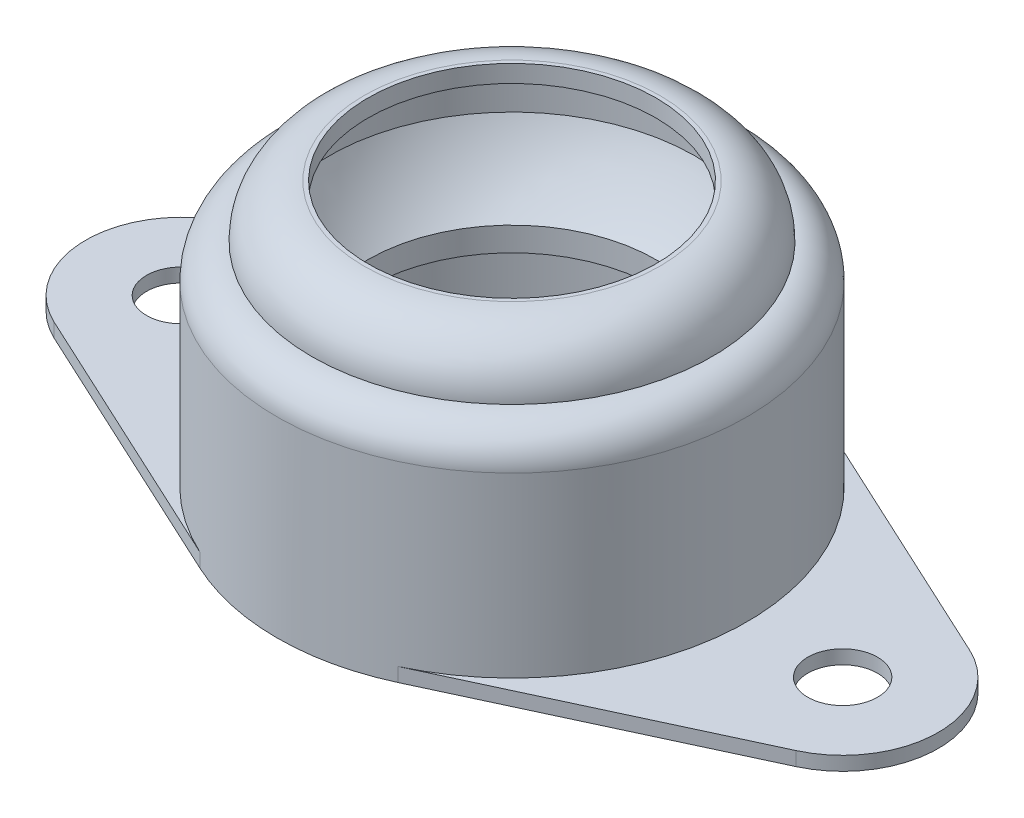
ISO-10303-21;
HEADER;
FILE_DESCRIPTION(('STEP AP214'),'2;1');
FILE_NAME('part.step','',(''),(''),'','','');
FILE_SCHEMA(('AUTOMOTIVE_DESIGN { 1 0 10303 214 1 1 1 1 }'));
ENDSEC;
DATA;
#1=APPLICATION_CONTEXT('core data for automotive mechanical design processes');
#2=APPLICATION_PROTOCOL_DEFINITION('international standard','automotive_design',2000,#1);
#3=PRODUCT_CONTEXT('',#1,'mechanical');
#4=PRODUCT('Part','Part','',(#3));
#5=PRODUCT_RELATED_PRODUCT_CATEGORY('part','',(#4));
#6=PRODUCT_DEFINITION_FORMATION('','',#4);
#7=PRODUCT_DEFINITION_CONTEXT('part definition',#1,'design');
#8=PRODUCT_DEFINITION('design','',#6,#7);
#9=PRODUCT_DEFINITION_SHAPE('','',#8);
#10=(LENGTH_UNIT() NAMED_UNIT(*) SI_UNIT(.MILLI.,.METRE.));
#11=(NAMED_UNIT(*) PLANE_ANGLE_UNIT() SI_UNIT($,.RADIAN.));
#12=(NAMED_UNIT(*) SI_UNIT($,.STERADIAN.) SOLID_ANGLE_UNIT());
#13=UNCERTAINTY_MEASURE_WITH_UNIT(LENGTH_MEASURE(1.E-05),#10,'distance_accuracy_value','');
#14=(GEOMETRIC_REPRESENTATION_CONTEXT(3) GLOBAL_UNCERTAINTY_ASSIGNED_CONTEXT((#13)) GLOBAL_UNIT_ASSIGNED_CONTEXT((#10,
#11,#12)) REPRESENTATION_CONTEXT('',''));
#15=CARTESIAN_POINT('',(0.,0.,0.));
#16=DIRECTION('',(0.,0.,1.));
#17=DIRECTION('',(1.,0.,0.));
#18=AXIS2_PLACEMENT_3D('',#15,#16,#17);
#19=CARTESIAN_POINT('',(0.,16.,0.));
#20=DIRECTION('',(0.,-1.,0.));
#21=DIRECTION('',(-1.,0.,0.));
#22=AXIS2_PLACEMENT_3D('',#19,#20,#21);
#23=SPHERICAL_SURFACE('',#22,12.5399362039845);
#24=CARTESIAN_POINT('',(0.,10.7108906022991,0.));
#25=DIRECTION('',(0.,-1.,0.));
#26=DIRECTION('',(0.,0.,-1.));
#27=AXIS2_PLACEMENT_3D('',#24,#25,#26);
#28=CIRCLE('',#27,11.3699305969365);
#29=CARTESIAN_POINT('',(-11.3699305969365,10.7108906022991,0.));
#30=VERTEX_POINT('',#29);
#31=EDGE_CURVE('E213',#30,#30,#28,.T.);
#32=CARTESIAN_POINT('',(0.,6.57281984399367,0.));
#33=DIRECTION('',(0.,1.,0.));
#34=DIRECTION('',(0.,0.,1.));
#35=AXIS2_PLACEMENT_3D('',#32,#33,#34);
#36=CIRCLE('',#35,8.26911569070118);
#37=CARTESIAN_POINT('',(-8.26911569070118,6.57281984399367,0.));
#38=VERTEX_POINT('',#37);
#39=EDGE_CURVE('E403',#38,#38,#36,.T.);
#40=CARTESIAN_POINT('',(-11.3699305969365,10.7108906022991,0.));
#41=CARTESIAN_POINT('',(-11.3470476628489,10.6616994020522,0.));
#42=CARTESIAN_POINT('',(-11.3238454577825,10.6126567220733,0.));
#43=CARTESIAN_POINT('',(-11.2768064986296,10.5148766237988,0.));
#44=CARTESIAN_POINT('',(-11.2529697445431,10.4661392055032,0.));
#45=CARTESIAN_POINT('',(-11.2046656802875,10.368977851743,0.));
#46=CARTESIAN_POINT('',(-11.1801983701183,10.3205539162783,0.));
#47=CARTESIAN_POINT('',(-11.1306373215008,10.2240276827389,0.));
#48=CARTESIAN_POINT('',(-11.1055435830523,10.1759253846643,0.));
#49=CARTESIAN_POINT('',(-11.0547339035324,10.0800505299735,0.));
#50=CARTESIAN_POINT('',(-11.0290179624609,10.0322779733573,0.));
#51=CARTESIAN_POINT('',(-10.9769682102236,9.93707064911464,0.));
#52=CARTESIAN_POINT('',(-10.9506343990578,9.88963588148808,0.));
#53=CARTESIAN_POINT('',(-10.8973533426957,9.79511212611695,0.));
#54=CARTESIAN_POINT('',(-10.8704060974993,9.74802313837237,0.));
#55=CARTESIAN_POINT('',(-10.8159027126261,9.65419887533668,0.));
#56=CARTESIAN_POINT('',(-10.7883465729493,9.60746360004556,0.));
#57=CARTESIAN_POINT('',(-10.7326300412,9.51435463492106,0.));
#58=CARTESIAN_POINT('',(-10.7044696491274,9.46798094508768,0.));
#59=CARTESIAN_POINT('',(-10.6475493564739,9.37560296296536,0.));
#60=CARTESIAN_POINT('',(-10.6187894558929,9.32959867067641,0.));
#61=CARTESIAN_POINT('',(-10.5606749910997,9.23796723350249,0.));
#62=CARTESIAN_POINT('',(-10.5313204268876,9.19234008861751,0.));
#63=CARTESIAN_POINT('',(-10.4720215798871,9.10147063257663,0.));
#64=CARTESIAN_POINT('',(-10.4420772970987,9.05622832142073,0.));
#65=CARTESIAN_POINT('',(-10.381604057344,8.96613615433434,0.));
#66=CARTESIAN_POINT('',(-10.3510751003777,8.92128629840384,0.));
#67=CARTESIAN_POINT('',(-10.2894376551594,8.83198659715174,0.));
#68=CARTESIAN_POINT('',(-10.2583291669074,8.78753675183014,0.));
#69=CARTESIAN_POINT('',(-10.1955378996376,8.69904455979375,0.));
#70=CARTESIAN_POINT('',(-10.1638551206198,8.65500221307896,0.));
#71=CARTESIAN_POINT('',(-10.0999206090829,8.5673324376071,0.));
#72=CARTESIAN_POINT('',(-10.0676688765637,8.52370500885003,0.));
#73=CARTESIAN_POINT('',(-10.0026018911343,8.43687241874767,0.));
#74=CARTESIAN_POINT('',(-9.96978663822408,8.39366725740237,0.));
#75=CARTESIAN_POINT('',(-9.90359814005291,8.30768648044265,0.));
#76=CARTESIAN_POINT('',(-9.870224894792,8.26491086482822,0.));
#77=CARTESIAN_POINT('',(-9.80292603395915,8.17979638528829,0.));
#78=CARTESIAN_POINT('',(-9.76900041838721,8.13745752136278,0.));
#79=CARTESIAN_POINT('',(-9.70060253202392,8.05322367758376,0.));
#80=CARTESIAN_POINT('',(-9.66613026123257,8.01132869773025,0.));
#81=CARTESIAN_POINT('',(-9.59664487161134,7.92798967970185,0.));
#82=CARTESIAN_POINT('',(-9.56163175278146,7.88654564152695,0.));
#83=CARTESIAN_POINT('',(-9.49107056537505,7.80411548849694,0.));
#84=CARTESIAN_POINT('',(-9.45552249679852,7.76312937364182,0.));
#85=CARTESIAN_POINT('',(-9.38389739830793,7.68162197175117,0.));
#86=CARTESIAN_POINT('',(-9.34782036839386,7.64110068471564,0.));
#87=CARTESIAN_POINT('',(-9.27514342474639,7.5605297646587,0.));
#88=CARTESIAN_POINT('',(-9.23854351101299,7.52048013163729,0.));
#89=CARTESIAN_POINT('',(-9.16482696532771,7.44085926635085,0.));
#90=CARTESIAN_POINT('',(-9.12771033337583,7.40128803408583,0.));
#91=CARTESIAN_POINT('',(-9.05296660390838,7.32263063645458,0.));
#92=CARTESIAN_POINT('',(-9.01533950639281,7.28354447108835,0.));
#93=CARTESIAN_POINT('',(-8.93958118441617,7.20586379171557,0.));
#94=CARTESIAN_POINT('',(-8.90144995995511,7.16726927770903,0.));
#95=CARTESIAN_POINT('',(-8.82468980774026,7.09057840257144,0.));
#96=CARTESIAN_POINT('',(-8.78606087998648,7.0524820414404,0.));
#97=CARTESIAN_POINT('',(-8.70831182827267,6.97679389010545,0.));
#98=CARTESIAN_POINT('',(-8.66919170431265,6.93920209990154,0.));
#99=CARTESIAN_POINT('',(-8.59046685154645,6.86452942177687,0.));
#100=CARTESIAN_POINT('',(-8.55086212274029,6.82744853385611,0.));
#101=CARTESIAN_POINT('',(-8.47117472757947,6.75380391191654,0.));
#102=CARTESIAN_POINT('',(-8.43109206122482,6.71724017789773,0.));
#103=CARTESIAN_POINT('',(-8.3504555600457,6.64463600464066,0.));
#104=CARTESIAN_POINT('',(-8.30990172522123,6.60859556540239,0.));
#105=CARTESIAN_POINT('',(-8.26911569070118,6.57281984399367,0.));
#106=B_SPLINE_CURVE_WITH_KNOTS('',3,(#40,#41,#42,#43,#44,#45,#46,#47,#48,#49,#50,#51,#52,#53,
#54,#55,#56,#57,#58,#59,#60,#61,#62,#63,#64,#65,#66,#67,#68,#69,#70,#71,#72,#73,#74,#75,#76,#77,
#78,#79,#80,#81,#82,#83,#84,#85,#86,#87,#88,#89,#90,#91,#92,#93,#94,#95,#96,#97,#98,#99,#100,
#101,#102,#103,#104,#105),.UNSPECIFIED.,.F.,.F.,(4,2,2,2,2,2,2,2,2,2,2,2,2,2,2,2,2,2,2,2,2,2,2,
2,2,2,2,2,2,2,2,2,4),(0.,0.162758267193495,0.325516534386989,0.488274801580485,0.65103306877398,
0.813791335967474,0.976549603160969,1.13930787035446,1.30206613754796,1.46482440474145,
1.62758267193495,1.79034093912844,1.95309920632194,2.11585747351543,2.27861574070893,
2.44137400790242,2.60413227509592,2.76689054228941,2.92964880948291,3.0924070766764,
3.2551653438699,3.41792361106339,3.58068187825689,3.74344014545038,3.90619841264388,
4.06895667983737,4.23171494703087,4.39447321422436,4.55723148141786,4.71998974861135,
4.88274801580485,5.04550628299834,5.20826455019184),.UNSPECIFIED.);
#107=EDGE_CURVE('BSEAM41',#30,#38,#106,.T.);
#108=ORIENTED_EDGE('',*,*,#31,.T.);
#109=ORIENTED_EDGE('',*,*,#39,.T.);
#110=ORIENTED_EDGE('',*,*,#107,.T.);
#111=ORIENTED_EDGE('',*,*,#107,.F.);
#112=EDGE_LOOP('',(#108,#110,#109,#111));
#113=FACE_BOUND('',#112,.T.);
#114=ADVANCED_FACE('F41',(#113),#23,.T.);
#115=CARTESIAN_POINT('',(0.,0.,0.));
#116=DIRECTION('',(0.,1.,0.));
#117=DIRECTION('',(0.,0.,1.));
#118=AXIS2_PLACEMENT_3D('',#115,#116,#117);
#119=PLANE('',#118);
#120=CARTESIAN_POINT('',(19.,0.,0.));
#121=DIRECTION('',(0.,-1.,0.));
#122=DIRECTION('',(0.,0.,-1.));
#123=AXIS2_PLACEMENT_3D('',#120,#121,#122);
#124=CIRCLE('',#123,2.);
#125=CARTESIAN_POINT('',(19.,0.,-2.));
#126=VERTEX_POINT('',#125);
#127=EDGE_CURVE('E138',#126,#126,#124,.T.);
#128=ORIENTED_EDGE('',*,*,#127,.F.);
#129=EDGE_LOOP('',(#128));
#130=FACE_BOUND('',#129,.T.);
#131=DIRECTION('',(0.90703620734811,0.,-0.421052631578947));
#132=VECTOR('',#131,1.);
#133=CARTESIAN_POINT('',(5.68421052631578,0.,12.2449887991995));
#134=LINE('',#133,#132);
#135=CARTESIAN_POINT('',(5.68421052631578,0.,12.2449887991995));
#136=VERTEX_POINT('',#135);
#137=CARTESIAN_POINT('',(21.3157894736842,0.,4.9886991404146));
#138=VERTEX_POINT('',#137);
#139=EDGE_CURVE('E132',#136,#138,#134,.T.);
#140=ORIENTED_EDGE('',*,*,#139,.F.);
#141=CARTESIAN_POINT('',(0.,0.,0.));
#142=DIRECTION('',(0.,1.,0.));
#143=DIRECTION('',(0.,0.,1.));
#144=AXIS2_PLACEMENT_3D('',#141,#142,#143);
#145=CIRCLE('',#144,13.5);
#146=CARTESIAN_POINT('',(5.68421052631579,0.,-12.2449887991995));
#147=VERTEX_POINT('',#146);
#148=EDGE_CURVE('E51',#136,#147,#145,.T.);
#149=ORIENTED_EDGE('',*,*,#148,.T.);
#150=DIRECTION('',(0.90703620734811,0.,0.421052631578947));
#151=VECTOR('',#150,1.);
#152=CARTESIAN_POINT('',(5.68421052631578,0.,-12.2449887991995));
#153=LINE('',#152,#151);
#154=CARTESIAN_POINT('',(21.3157894736842,0.,-4.9886991404146));
#155=VERTEX_POINT('',#154);
#156=EDGE_CURVE('E141',#147,#155,#153,.T.);
#157=ORIENTED_EDGE('',*,*,#156,.T.);
#158=CARTESIAN_POINT('',(19.,0.,0.));
#159=DIRECTION('',(0.,-1.,0.));
#160=DIRECTION('',(0.,0.,-1.));
#161=AXIS2_PLACEMENT_3D('',#158,#159,#160);
#162=CIRCLE('',#161,5.5);
#163=EDGE_CURVE('E113',#155,#138,#162,.T.);
#164=ORIENTED_EDGE('',*,*,#163,.T.);
#165=EDGE_LOOP('',(#140,#149,#157,#164));
#166=FACE_BOUND('',#165,.T.);
#167=ADVANCED_FACE('F221',(#130,#166),#119,.F.);
#168=CARTESIAN_POINT('',(0.,30.5884475921695,0.));
#169=DIRECTION('',(0.,1.,0.));
#170=DIRECTION('',(0.,0.,1.));
#171=AXIS2_PLACEMENT_3D('',#168,#169,#170);
#172=CYLINDRICAL_SURFACE('',#171,12.5);
#173=CARTESIAN_POINT('',(0.,1.,0.));
#174=DIRECTION('',(0.,1.,0.));
#175=DIRECTION('',(0.,0.,1.));
#176=AXIS2_PLACEMENT_3D('',#173,#174,#175);
#177=CIRCLE('',#176,12.5);
#178=CARTESIAN_POINT('',(0.,1.,12.5));
#179=VERTEX_POINT('',#178);
#180=EDGE_CURVE('E11',#179,#179,#177,.F.);
#181=ORIENTED_EDGE('',*,*,#180,.T.);
#182=EDGE_LOOP('',(#181));
#183=FACE_BOUND('',#182,.T.);
#184=CARTESIAN_POINT('',(0.,10.5,0.));
#185=DIRECTION('',(0.,1.,0.));
#186=DIRECTION('',(0.,0.,1.));
#187=AXIS2_PLACEMENT_3D('',#184,#185,#186);
#188=CIRCLE('',#187,12.5);
#189=CARTESIAN_POINT('',(0.,10.5,12.5));
#190=VERTEX_POINT('',#189);
#191=EDGE_CURVE('E206',#190,#190,#188,.F.);
#192=ORIENTED_EDGE('',*,*,#191,.F.);
#193=EDGE_LOOP('',(#192));
#194=FACE_BOUND('',#193,.T.);
#195=ADVANCED_FACE('F267',(#183,#194),#172,.F.);
#196=CARTESIAN_POINT('',(0.,30.5884475921695,0.));
#197=DIRECTION('',(0.,1.,0.));
#198=DIRECTION('',(0.,0.,1.));
#199=AXIS2_PLACEMENT_3D('',#196,#197,#198);
#200=CYLINDRICAL_SURFACE('',#199,13.5);
#201=CARTESIAN_POINT('',(0.,11.,0.));
#202=DIRECTION('',(0.,-1.,0.));
#203=DIRECTION('',(0.,0.,-1.));
#204=AXIS2_PLACEMENT_3D('',#201,#202,#203);
#205=CIRCLE('',#204,13.5);
#206=CARTESIAN_POINT('',(0.,11.,-13.5));
#207=VERTEX_POINT('',#206);
#208=EDGE_CURVE('E200',#207,#207,#205,.T.);
#209=ORIENTED_EDGE('',*,*,#208,.T.);
#210=EDGE_LOOP('',(#209));
#211=FACE_BOUND('',#210,.T.);
#212=DIRECTION('',(0.,-1.,0.));
#213=VECTOR('',#212,1.);
#214=CARTESIAN_POINT('',(5.68421052631579,0.8,-12.2449887991995));
#215=LINE('',#214,#213);
#216=CARTESIAN_POINT('',(5.68421052631579,0.799999999999999,-12.2449887991995));
#217=VERTEX_POINT('',#216);
#218=EDGE_CURVE('E128',#217,#147,#215,.T.);
#219=ORIENTED_EDGE('',*,*,#218,.T.);
#220=CARTESIAN_POINT('',(0.,0.,0.));
#221=DIRECTION('',(0.,1.,0.));
#222=DIRECTION('',(0.,0.,1.));
#223=AXIS2_PLACEMENT_3D('',#220,#221,#222);
#224=CIRCLE('',#223,13.5);
#225=CARTESIAN_POINT('',(-5.68421052631579,0.,-12.2449887991995));
#226=VERTEX_POINT('',#225);
#227=EDGE_CURVE('E188',#147,#226,#224,.T.);
#228=ORIENTED_EDGE('',*,*,#227,.T.);
#229=DIRECTION('',(0.,-1.,0.));
#230=VECTOR('',#229,1.);
#231=CARTESIAN_POINT('',(-5.68421052631579,0.8,-12.2449887991995));
#232=LINE('',#231,#230);
#233=CARTESIAN_POINT('',(-5.68421052631579,0.799999999999999,-12.2449887991995));
#234=VERTEX_POINT('',#233);
#235=EDGE_CURVE('E181',#234,#226,#232,.T.);
#236=ORIENTED_EDGE('',*,*,#235,.F.);
#237=CARTESIAN_POINT('',(0.,0.8,0.));
#238=DIRECTION('',(0.,-1.,0.));
#239=DIRECTION('',(0.,0.,-1.));
#240=AXIS2_PLACEMENT_3D('',#237,#238,#239);
#241=CIRCLE('',#240,13.5);
#242=CARTESIAN_POINT('',(-5.68421052631579,0.799999999999999,12.2449887991995));
#243=VERTEX_POINT('',#242);
#244=EDGE_CURVE('E156',#243,#234,#241,.T.);
#245=ORIENTED_EDGE('',*,*,#244,.F.);
#246=DIRECTION('',(0.,-1.,0.));
#247=VECTOR('',#246,1.);
#248=CARTESIAN_POINT('',(-5.68421052631579,0.8,12.2449887991995));
#249=LINE('',#248,#247);
#250=CARTESIAN_POINT('',(-5.68421052631579,0.,12.2449887991995));
#251=VERTEX_POINT('',#250);
#252=EDGE_CURVE('E178',#243,#251,#249,.T.);
#253=ORIENTED_EDGE('',*,*,#252,.T.);
#254=EDGE_CURVE('E189',#251,#136,#224,.T.);
#255=ORIENTED_EDGE('',*,*,#254,.T.);
#256=DIRECTION('',(0.,-1.,0.));
#257=VECTOR('',#256,1.);
#258=CARTESIAN_POINT('',(5.68421052631579,0.8,12.2449887991995));
#259=LINE('',#258,#257);
#260=CARTESIAN_POINT('',(5.68421052631579,0.799999999999999,12.2449887991995));
#261=VERTEX_POINT('',#260);
#262=EDGE_CURVE('E58',#261,#136,#259,.T.);
#263=ORIENTED_EDGE('',*,*,#262,.F.);
#264=CARTESIAN_POINT('',(0.,0.8,0.));
#265=DIRECTION('',(0.,-1.,0.));
#266=DIRECTION('',(0.,0.,-1.));
#267=AXIS2_PLACEMENT_3D('',#264,#265,#266);
#268=CIRCLE('',#267,13.5);
#269=EDGE_CURVE('E63',#217,#261,#268,.T.);
#270=ORIENTED_EDGE('',*,*,#269,.F.);
#271=EDGE_LOOP('',(#219,#228,#236,#245,#253,#255,#263,#270));
#272=FACE_BOUND('',#271,.T.);
#273=ADVANCED_FACE('F224',(#211,#272),#200,.T.);
#274=DIRECTION('',(-0.90703620734811,0.,0.421052631578947));
#275=VECTOR('',#274,1.);
#276=CARTESIAN_POINT('',(-5.68421052631578,0.,-12.2449887991995));
#277=LINE('',#276,#275);
#278=CARTESIAN_POINT('',(-21.3157894736842,0.,-4.9886991404146));
#279=VERTEX_POINT('',#278);
#280=EDGE_CURVE('E168',#226,#279,#277,.T.);
#281=ORIENTED_EDGE('',*,*,#280,.F.);
#282=CARTESIAN_POINT('',(0.,0.,0.));
#283=DIRECTION('',(0.,1.,0.));
#284=DIRECTION('',(0.,0.,1.));
#285=AXIS2_PLACEMENT_3D('',#282,#283,#284);
#286=CIRCLE('',#285,13.5);
#287=EDGE_CURVE('E209',#226,#251,#286,.T.);
#288=ORIENTED_EDGE('',*,*,#287,.T.);
#289=DIRECTION('',(-0.90703620734811,0.,-0.421052631578947));
#290=VECTOR('',#289,1.);
#291=CARTESIAN_POINT('',(-5.68421052631578,0.,12.2449887991995));
#292=LINE('',#291,#290);
#293=CARTESIAN_POINT('',(-21.3157894736842,0.,4.9886991404146));
#294=VERTEX_POINT('',#293);
#295=EDGE_CURVE('E170',#251,#294,#292,.T.);
#296=ORIENTED_EDGE('',*,*,#295,.T.);
#297=CARTESIAN_POINT('',(-19.,0.,0.));
#298=DIRECTION('',(0.,-1.,0.));
#299=DIRECTION('',(0.,0.,-1.));
#300=AXIS2_PLACEMENT_3D('',#297,#298,#299);
#301=CIRCLE('',#300,5.5);
#302=EDGE_CURVE('E148',#279,#294,#301,.F.);
#303=ORIENTED_EDGE('',*,*,#302,.F.);
#304=EDGE_LOOP('',(#281,#288,#296,#303));
#305=FACE_BOUND('',#304,.T.);
#306=CARTESIAN_POINT('',(-19.,0.,0.));
#307=DIRECTION('',(0.,-1.,0.));
#308=DIRECTION('',(0.,0.,-1.));
#309=AXIS2_PLACEMENT_3D('',#306,#307,#308);
#310=CIRCLE('',#309,2.);
#311=CARTESIAN_POINT('',(-19.,0.,-2.));
#312=VERTEX_POINT('',#311);
#313=EDGE_CURVE('E154',#312,#312,#310,.F.);
#314=ORIENTED_EDGE('',*,*,#313,.T.);
#315=EDGE_LOOP('',(#314));
#316=FACE_BOUND('',#315,.T.);
#317=ADVANCED_FACE('F233',(#305,#316),#119,.F.);
#318=CARTESIAN_POINT('',(0.,16.,0.));
#319=DIRECTION('',(0.,-1.,0.));
#320=DIRECTION('',(0.,0.,-1.));
#321=AXIS2_PLACEMENT_3D('',#318,#319,#320);
#322=PLANE('',#321);
#323=CARTESIAN_POINT('',(0.,16.,0.));
#324=DIRECTION('',(0.,-1.,0.));
#325=DIRECTION('',(0.,0.,-1.));
#326=AXIS2_PLACEMENT_3D('',#323,#324,#325);
#327=CIRCLE('',#326,8.26911569070118);
#328=CARTESIAN_POINT('',(0.,16.,-8.26911569070118));
#329=VERTEX_POINT('',#328);
#330=EDGE_CURVE('E361',#329,#329,#327,.F.);
#331=ORIENTED_EDGE('',*,*,#330,.F.);
#332=EDGE_LOOP('',(#331));
#333=FACE_BOUND('',#332,.T.);
#334=CARTESIAN_POINT('',(0.,16.,0.));
#335=DIRECTION('',(0.,-1.,0.));
#336=DIRECTION('',(0.,0.,-1.));
#337=AXIS2_PLACEMENT_3D('',#334,#335,#336);
#338=CIRCLE('',#337,8.5);
#339=CARTESIAN_POINT('',(0.,16.,-8.5));
#340=VERTEX_POINT('',#339);
#341=EDGE_CURVE('E203',#340,#340,#338,.F.);
#342=ORIENTED_EDGE('',*,*,#341,.T.);
#343=EDGE_LOOP('',(#342));
#344=FACE_BOUND('',#343,.T.);
#345=ADVANCED_FACE('F257',(#333,#344),#322,.F.);
#346=CARTESIAN_POINT('',(0.,11.,0.));
#347=DIRECTION('',(0.,-1.,0.));
#348=DIRECTION('',(0.,0.,-1.));
#349=AXIS2_PLACEMENT_3D('',#346,#347,#348);
#350=TOROIDAL_SURFACE('',#349,11.5,2.);
#351=ORIENTED_EDGE('',*,*,#208,.F.);
#352=EDGE_LOOP('',(#351));
#353=FACE_BOUND('',#352,.T.);
#354=CARTESIAN_POINT('',(0.,13.,0.));
#355=DIRECTION('',(0.,1.,0.));
#356=DIRECTION('',(0.,0.,1.));
#357=AXIS2_PLACEMENT_3D('',#354,#355,#356);
#358=CIRCLE('',#357,11.5);
#359=CARTESIAN_POINT('',(0.,13.,11.5));
#360=VERTEX_POINT('',#359);
#361=EDGE_CURVE('E177',#360,#360,#358,.T.);
#362=ORIENTED_EDGE('',*,*,#361,.F.);
#363=EDGE_LOOP('',(#362));
#364=FACE_BOUND('',#363,.T.);
#365=ADVANCED_FACE('F264',(#353,#364),#350,.T.);
#366=CARTESIAN_POINT('',(0.,13.,0.));
#367=DIRECTION('',(0.,-1.,0.));
#368=DIRECTION('',(0.,0.,-1.));
#369=AXIS2_PLACEMENT_3D('',#366,#367,#368);
#370=TOROIDAL_SURFACE('',#369,8.5,3.);
#371=ORIENTED_EDGE('',*,*,#361,.T.);
#372=EDGE_LOOP('',(#371));
#373=FACE_BOUND('',#372,.T.);
#374=ORIENTED_EDGE('',*,*,#341,.F.);
#375=EDGE_LOOP('',(#374));
#376=FACE_BOUND('',#375,.T.);
#377=ADVANCED_FACE('F312',(#373,#376),#370,.T.);
#378=CARTESIAN_POINT('',(-19.,0.8,0.));
#379=DIRECTION('',(0.,-1.,0.));
#380=DIRECTION('',(0.,0.,-1.));
#381=AXIS2_PLACEMENT_3D('',#378,#379,#380);
#382=CYLINDRICAL_SURFACE('',#381,5.5);
#383=ORIENTED_EDGE('',*,*,#302,.T.);
#384=DIRECTION('',(0.,-1.,0.));
#385=VECTOR('',#384,1.);
#386=CARTESIAN_POINT('',(-21.3157894736842,0.8,4.9886991404146));
#387=LINE('',#386,#385);
#388=CARTESIAN_POINT('',(-21.3157894736842,0.8,4.9886991404146));
#389=VERTEX_POINT('',#388);
#390=EDGE_CURVE('E175',#389,#294,#387,.T.);
#391=ORIENTED_EDGE('',*,*,#390,.F.);
#392=CARTESIAN_POINT('',(-19.,0.8,0.));
#393=DIRECTION('',(0.,-1.,0.));
#394=DIRECTION('',(0.,0.,-1.));
#395=AXIS2_PLACEMENT_3D('',#392,#393,#394);
#396=CIRCLE('',#395,5.5);
#397=CARTESIAN_POINT('',(-21.3157894736842,0.8,-4.9886991404146));
#398=VERTEX_POINT('',#397);
#399=EDGE_CURVE('E151',#398,#389,#396,.F.);
#400=ORIENTED_EDGE('',*,*,#399,.F.);
#401=DIRECTION('',(0.,-1.,0.));
#402=VECTOR('',#401,1.);
#403=CARTESIAN_POINT('',(-21.3157894736842,0.8,-4.9886991404146));
#404=LINE('',#403,#402);
#405=EDGE_CURVE('E165',#398,#279,#404,.T.);
#406=ORIENTED_EDGE('',*,*,#405,.T.);
#407=EDGE_LOOP('',(#383,#391,#400,#406));
#408=FACE_BOUND('',#407,.T.);
#409=ADVANCED_FACE('F243',(#408),#382,.T.);
#410=CARTESIAN_POINT('',(-5.68421052631578,0.8,12.2449887991995));
#411=DIRECTION('',(-0.421052631578947,0.,0.90703620734811));
#412=DIRECTION('',(0.90703620734811,0.,0.421052631578947));
#413=AXIS2_PLACEMENT_3D('',#410,#411,#412);
#414=PLANE('',#413);
#415=ORIENTED_EDGE('',*,*,#295,.F.);
#416=ORIENTED_EDGE('',*,*,#252,.F.);
#417=DIRECTION('',(-0.90703620734811,0.,-0.421052631578947));
#418=VECTOR('',#417,1.);
#419=CARTESIAN_POINT('',(-5.68421052631578,0.8,12.2449887991995));
#420=LINE('',#419,#418);
#421=EDGE_CURVE('E159',#243,#389,#420,.T.);
#422=ORIENTED_EDGE('',*,*,#421,.T.);
#423=ORIENTED_EDGE('',*,*,#390,.T.);
#424=EDGE_LOOP('',(#415,#416,#422,#423));
#425=FACE_BOUND('',#424,.T.);
#426=ADVANCED_FACE('F239',(#425),#414,.T.);
#427=CARTESIAN_POINT('',(-5.68421052631578,0.8,-12.2449887991995));
#428=DIRECTION('',(0.421052631578947,0.,0.90703620734811));
#429=DIRECTION('',(0.90703620734811,0.,-0.421052631578947));
#430=AXIS2_PLACEMENT_3D('',#427,#428,#429);
#431=PLANE('',#430);
#432=ORIENTED_EDGE('',*,*,#280,.T.);
#433=ORIENTED_EDGE('',*,*,#405,.F.);
#434=DIRECTION('',(-0.90703620734811,0.,0.421052631578947));
#435=VECTOR('',#434,1.);
#436=CARTESIAN_POINT('',(-5.68421052631578,0.8,-12.2449887991995));
#437=LINE('',#436,#435);
#438=EDGE_CURVE('E153',#234,#398,#437,.T.);
#439=ORIENTED_EDGE('',*,*,#438,.F.);
#440=ORIENTED_EDGE('',*,*,#235,.T.);
#441=EDGE_LOOP('',(#432,#433,#439,#440));
#442=FACE_BOUND('',#441,.T.);
#443=ADVANCED_FACE('F229',(#442),#431,.F.);
#444=CARTESIAN_POINT('',(-19.,0.8,0.));
#445=DIRECTION('',(0.,-1.,0.));
#446=DIRECTION('',(0.,0.,-1.));
#447=AXIS2_PLACEMENT_3D('',#444,#445,#446);
#448=CYLINDRICAL_SURFACE('',#447,2.);
#449=CARTESIAN_POINT('',(-19.,0.8,0.));
#450=DIRECTION('',(0.,-1.,0.));
#451=DIRECTION('',(0.,0.,-1.));
#452=AXIS2_PLACEMENT_3D('',#449,#450,#451);
#453=CIRCLE('',#452,2.);
#454=CARTESIAN_POINT('',(-19.,0.8,-2.));
#455=VERTEX_POINT('',#454);
#456=EDGE_CURVE('E162',#455,#455,#453,.F.);
#457=ORIENTED_EDGE('',*,*,#456,.T.);
#458=EDGE_LOOP('',(#457));
#459=FACE_BOUND('',#458,.T.);
#460=ORIENTED_EDGE('',*,*,#313,.F.);
#461=EDGE_LOOP('',(#460));
#462=FACE_BOUND('',#461,.T.);
#463=ADVANCED_FACE('F248',(#459,#462),#448,.F.);
#464=CARTESIAN_POINT('',(0.,0.8,0.));
#465=DIRECTION('',(0.,-1.,0.));
#466=DIRECTION('',(0.,0.,-1.));
#467=AXIS2_PLACEMENT_3D('',#464,#465,#466);
#468=PLANE('',#467);
#469=ORIENTED_EDGE('',*,*,#399,.T.);
#470=ORIENTED_EDGE('',*,*,#421,.F.);
#471=ORIENTED_EDGE('',*,*,#244,.T.);
#472=ORIENTED_EDGE('',*,*,#438,.T.);
#473=EDGE_LOOP('',(#469,#470,#471,#472));
#474=FACE_BOUND('',#473,.T.);
#475=ORIENTED_EDGE('',*,*,#456,.F.);
#476=EDGE_LOOP('',(#475));
#477=FACE_BOUND('',#476,.T.);
#478=ADVANCED_FACE('F245',(#474,#477),#468,.F.);
#479=CARTESIAN_POINT('',(5.68421052631578,0.8,-12.2449887991995));
#480=DIRECTION('',(0.421052631578947,0.,-0.90703620734811));
#481=DIRECTION('',(-0.90703620734811,0.,-0.421052631578947));
#482=AXIS2_PLACEMENT_3D('',#479,#480,#481);
#483=PLANE('',#482);
#484=ORIENTED_EDGE('',*,*,#156,.F.);
#485=ORIENTED_EDGE('',*,*,#218,.F.);
#486=DIRECTION('',(0.90703620734811,0.,0.421052631578947));
#487=VECTOR('',#486,1.);
#488=CARTESIAN_POINT('',(5.68421052631578,0.8,-12.2449887991995));
#489=LINE('',#488,#487);
#490=CARTESIAN_POINT('',(21.3157894736842,0.8,-4.9886991404146));
#491=VERTEX_POINT('',#490);
#492=EDGE_CURVE('E123',#217,#491,#489,.T.);
#493=ORIENTED_EDGE('',*,*,#492,.T.);
#494=DIRECTION('',(0.,-1.,0.));
#495=VECTOR('',#494,1.);
#496=CARTESIAN_POINT('',(21.3157894736842,0.8,-4.9886991404146));
#497=LINE('',#496,#495);
#498=EDGE_CURVE('E108',#491,#155,#497,.T.);
#499=ORIENTED_EDGE('',*,*,#498,.T.);
#500=EDGE_LOOP('',(#484,#485,#493,#499));
#501=FACE_BOUND('',#500,.T.);
#502=ADVANCED_FACE('F127',(#501),#483,.T.);
#503=CARTESIAN_POINT('',(5.68421052631578,0.8,12.2449887991995));
#504=DIRECTION('',(-0.421052631578947,0.,-0.90703620734811));
#505=DIRECTION('',(-0.90703620734811,0.,0.421052631578947));
#506=AXIS2_PLACEMENT_3D('',#503,#504,#505);
#507=PLANE('',#506);
#508=ORIENTED_EDGE('',*,*,#139,.T.);
#509=DIRECTION('',(0.,-1.,0.));
#510=VECTOR('',#509,1.);
#511=CARTESIAN_POINT('',(21.3157894736842,0.8,4.9886991404146));
#512=LINE('',#511,#510);
#513=CARTESIAN_POINT('',(21.3157894736842,0.8,4.9886991404146));
#514=VERTEX_POINT('',#513);
#515=EDGE_CURVE('E118',#514,#138,#512,.T.);
#516=ORIENTED_EDGE('',*,*,#515,.F.);
#517=DIRECTION('',(0.90703620734811,0.,-0.421052631578947));
#518=VECTOR('',#517,1.);
#519=CARTESIAN_POINT('',(5.68421052631578,0.8,12.2449887991995));
#520=LINE('',#519,#518);
#521=EDGE_CURVE('E124',#261,#514,#520,.T.);
#522=ORIENTED_EDGE('',*,*,#521,.F.);
#523=ORIENTED_EDGE('',*,*,#262,.T.);
#524=EDGE_LOOP('',(#508,#516,#522,#523));
#525=FACE_BOUND('',#524,.T.);
#526=ADVANCED_FACE('F295',(#525),#507,.F.);
#527=CARTESIAN_POINT('',(19.,0.8,0.));
#528=DIRECTION('',(0.,-1.,0.));
#529=DIRECTION('',(0.,0.,-1.));
#530=AXIS2_PLACEMENT_3D('',#527,#528,#529);
#531=CYLINDRICAL_SURFACE('',#530,2.);
#532=CARTESIAN_POINT('',(19.,0.8,0.));
#533=DIRECTION('',(0.,-1.,0.));
#534=DIRECTION('',(0.,0.,-1.));
#535=AXIS2_PLACEMENT_3D('',#532,#533,#534);
#536=CIRCLE('',#535,2.);
#537=CARTESIAN_POINT('',(19.,0.8,-2.));
#538=VERTEX_POINT('',#537);
#539=EDGE_CURVE('E129',#538,#538,#536,.T.);
#540=ORIENTED_EDGE('',*,*,#539,.F.);
#541=EDGE_LOOP('',(#540));
#542=FACE_BOUND('',#541,.T.);
#543=ORIENTED_EDGE('',*,*,#127,.T.);
#544=EDGE_LOOP('',(#543));
#545=FACE_BOUND('',#544,.T.);
#546=ADVANCED_FACE('F298',(#542,#545),#531,.F.);
#547=CARTESIAN_POINT('',(19.,0.8,0.));
#548=DIRECTION('',(0.,-1.,0.));
#549=DIRECTION('',(0.,0.,-1.));
#550=AXIS2_PLACEMENT_3D('',#547,#548,#549);
#551=CYLINDRICAL_SURFACE('',#550,5.5);
#552=ORIENTED_EDGE('',*,*,#163,.F.);
#553=ORIENTED_EDGE('',*,*,#498,.F.);
#554=CARTESIAN_POINT('',(19.,0.8,0.));
#555=DIRECTION('',(0.,-1.,0.));
#556=DIRECTION('',(0.,0.,-1.));
#557=AXIS2_PLACEMENT_3D('',#554,#555,#556);
#558=CIRCLE('',#557,5.5);
#559=EDGE_CURVE('E111',#491,#514,#558,.T.);
#560=ORIENTED_EDGE('',*,*,#559,.T.);
#561=ORIENTED_EDGE('',*,*,#515,.T.);
#562=EDGE_LOOP('',(#552,#553,#560,#561));
#563=FACE_BOUND('',#562,.T.);
#564=ADVANCED_FACE('F110',(#563),#551,.T.);
#565=CARTESIAN_POINT('',(0.,0.8,0.));
#566=DIRECTION('',(0.,-1.,0.));
#567=DIRECTION('',(0.,0.,-1.));
#568=AXIS2_PLACEMENT_3D('',#565,#566,#567);
#569=PLANE('',#568);
#570=ORIENTED_EDGE('',*,*,#539,.T.);
#571=EDGE_LOOP('',(#570));
#572=FACE_BOUND('',#571,.T.);
#573=ORIENTED_EDGE('',*,*,#492,.F.);
#574=ORIENTED_EDGE('',*,*,#269,.T.);
#575=ORIENTED_EDGE('',*,*,#521,.T.);
#576=ORIENTED_EDGE('',*,*,#559,.F.);
#577=EDGE_LOOP('',(#573,#574,#575,#576));
#578=FACE_BOUND('',#577,.T.);
#579=ADVANCED_FACE('F122',(#572,#578),#569,.F.);
#580=CARTESIAN_POINT('',(0.,10.5,0.));
#581=DIRECTION('',(0.,-1.,0.));
#582=DIRECTION('',(0.,0.,-1.));
#583=AXIS2_PLACEMENT_3D('',#580,#581,#582);
#584=TOROIDAL_SURFACE('',#583,12.,0.5);
#585=CARTESIAN_POINT('',(0.,11.,0.));
#586=DIRECTION('',(0.,-1.,0.));
#587=DIRECTION('',(0.,0.,-1.));
#588=AXIS2_PLACEMENT_3D('',#585,#586,#587);
#589=CIRCLE('',#588,12.);
#590=CARTESIAN_POINT('',(0.,11.,-12.));
#591=VERTEX_POINT('',#590);
#592=EDGE_CURVE('E354',#591,#591,#589,.T.);
#593=ORIENTED_EDGE('',*,*,#592,.F.);
#594=EDGE_LOOP('',(#593));
#595=FACE_BOUND('',#594,.T.);
#596=ORIENTED_EDGE('',*,*,#191,.T.);
#597=EDGE_LOOP('',(#596));
#598=FACE_BOUND('',#597,.T.);
#599=ADVANCED_FACE('F293',(#595,#598),#584,.F.);
#600=CARTESIAN_POINT('',(0.,11.,0.));
#601=DIRECTION('',(0.,1.,0.));
#602=DIRECTION('',(0.,0.,1.));
#603=AXIS2_PLACEMENT_3D('',#600,#601,#602);
#604=PLANE('',#603);
#605=CARTESIAN_POINT('',(0.,11.,0.));
#606=DIRECTION('',(0.,-1.,0.));
#607=DIRECTION('',(0.,0.,-1.));
#608=AXIS2_PLACEMENT_3D('',#605,#606,#607);
#609=CIRCLE('',#608,11.8232794183333);
#610=CARTESIAN_POINT('',(0.,11.,-11.8232794183333));
#611=VERTEX_POINT('',#610);
#612=EDGE_CURVE('E358',#611,#611,#609,.T.);
#613=ORIENTED_EDGE('',*,*,#612,.F.);
#614=EDGE_LOOP('',(#613));
#615=FACE_BOUND('',#614,.T.);
#616=ORIENTED_EDGE('',*,*,#592,.T.);
#617=EDGE_LOOP('',(#616));
#618=FACE_BOUND('',#617,.T.);
#619=ADVANCED_FACE('F370',(#615,#618),#604,.F.);
#620=CARTESIAN_POINT('',(0.,10.5,0.));
#621=DIRECTION('',(0.,-1.,0.));
#622=DIRECTION('',(0.,0.,-1.));
#623=AXIS2_PLACEMENT_3D('',#620,#621,#622);
#624=TOROIDAL_SURFACE('',#623,11.8232794183333,0.5);
#625=ORIENTED_EDGE('',*,*,#31,.F.);
#626=EDGE_LOOP('',(#625));
#627=FACE_BOUND('',#626,.T.);
#628=ORIENTED_EDGE('',*,*,#612,.T.);
#629=EDGE_LOOP('',(#628));
#630=FACE_BOUND('',#629,.T.);
#631=ADVANCED_FACE('F283',(#627,#630),#624,.F.);
#632=CARTESIAN_POINT('',(0.,1.,0.));
#633=DIRECTION('',(0.,1.,0.));
#634=DIRECTION('',(0.,0.,1.));
#635=AXIS2_PLACEMENT_3D('',#632,#633,#634);
#636=TOROIDAL_SURFACE('',#635,13.5,1.);
#637=ORIENTED_EDGE('',*,*,#180,.F.);
#638=EDGE_LOOP('',(#637));
#639=FACE_BOUND('',#638,.T.);
#640=ORIENTED_EDGE('',*,*,#227,.F.);
#641=ORIENTED_EDGE('',*,*,#148,.F.);
#642=ORIENTED_EDGE('',*,*,#254,.F.);
#643=ORIENTED_EDGE('',*,*,#287,.F.);
#644=EDGE_LOOP('',(#640,#641,#642,#643));
#645=FACE_BOUND('',#644,.T.);
#646=ADVANCED_FACE('F43',(#639,#645),#636,.T.);
#647=CARTESIAN_POINT('',(0.,31.,0.));
#648=DIRECTION('',(0.,-1.,0.));
#649=DIRECTION('',(0.,0.,-1.));
#650=AXIS2_PLACEMENT_3D('',#647,#648,#649);
#651=CYLINDRICAL_SURFACE('',#650,8.26911569070118);
#652=ORIENTED_EDGE('',*,*,#39,.F.);
#653=EDGE_LOOP('',(#652));
#654=FACE_BOUND('',#653,.T.);
#655=CARTESIAN_POINT('',(0.,7.95066131375809,0.));
#656=DIRECTION('',(0.,1.,0.));
#657=DIRECTION('',(0.,0.,1.));
#658=AXIS2_PLACEMENT_3D('',#655,#656,#657);
#659=CIRCLE('',#658,8.26911569070118);
#660=CARTESIAN_POINT('',(-8.26911569070118,7.95066131375809,0.));
#661=VERTEX_POINT('',#660);
#662=EDGE_CURVE('E45',#661,#661,#659,.T.);
#663=ORIENTED_EDGE('',*,*,#662,.T.);
#664=EDGE_LOOP('',(#663));
#665=FACE_BOUND('',#664,.T.);
#666=ADVANCED_FACE('F391',(#654,#665),#651,.F.);
#667=CARTESIAN_POINT('',(0.,15.,0.));
#668=DIRECTION('',(0.,-1.,0.));
#669=DIRECTION('',(0.,0.,-1.));
#670=AXIS2_PLACEMENT_3D('',#667,#668,#669);
#671=CIRCLE('',#670,8.26911569070118);
#672=CARTESIAN_POINT('',(0.,15.,-8.26911569070118));
#673=VERTEX_POINT('',#672);
#674=EDGE_CURVE('E400',#673,#673,#671,.F.);
#675=ORIENTED_EDGE('',*,*,#674,.F.);
#676=EDGE_LOOP('',(#675));
#677=FACE_BOUND('',#676,.T.);
#678=ORIENTED_EDGE('',*,*,#330,.T.);
#679=EDGE_LOOP('',(#678));
#680=FACE_BOUND('',#679,.T.);
#681=ADVANCED_FACE('F289',(#677,#680),#651,.F.);
#682=CARTESIAN_POINT('',(0.,16.,0.));
#683=DIRECTION('',(0.,-1.,0.));
#684=DIRECTION('',(-1.,0.,0.));
#685=AXIS2_PLACEMENT_3D('',#682,#683,#684);
#686=SPHERICAL_SURFACE('',#685,11.5399362039845);
#687=CARTESIAN_POINT('',(0.,12.,0.));
#688=DIRECTION('',(0.,-1.,0.));
#689=DIRECTION('',(0.,0.,-1.));
#690=AXIS2_PLACEMENT_3D('',#687,#688,#689);
#691=CIRCLE('',#690,10.8245151204121);
#692=CARTESIAN_POINT('',(-10.8245151204121,12.,0.));
#693=VERTEX_POINT('',#692);
#694=EDGE_CURVE('E142',#693,#693,#691,.T.);
#695=CARTESIAN_POINT('',(-10.8245151204121,12.,0.));
#696=CARTESIAN_POINT('',(-10.8071000080563,11.952872405256,0.));
#697=CARTESIAN_POINT('',(-10.7893770839075,11.9058585571701,0.));
#698=CARTESIAN_POINT('',(-10.7533187179021,11.8120663430242,0.));
#699=CARTESIAN_POINT('',(-10.7349832760456,11.7652879769644,0.));
#700=CARTESIAN_POINT('',(-10.697702980503,11.6719747155808,0.));
#701=CARTESIAN_POINT('',(-10.678758126817,11.6254398202571,0.));
#702=CARTESIAN_POINT('',(-10.6402622454562,11.5326214367565,0.));
#703=CARTESIAN_POINT('',(-10.6207112177814,11.4863379485796,0.));
#704=CARTESIAN_POINT('',(-10.5810063221923,11.3940302757784,0.));
#705=CARTESIAN_POINT('',(-10.560852454278,11.3480060911541,0.));
#706=CARTESIAN_POINT('',(-10.5199453168121,11.2562248768546,0.));
#707=CARTESIAN_POINT('',(-10.4991920472605,11.2104678471795,0.));
#708=CARTESIAN_POINT('',(-10.4570896468389,11.1192287488067,0.));
#709=CARTESIAN_POINT('',(-10.435740515969,11.0737466801089,0.));
#710=CARTESIAN_POINT('',(-10.3924500350262,10.9830652627558,0.));
#711=CARTESIAN_POINT('',(-10.3705086849533,10.9378659141006,0.));
#712=CARTESIAN_POINT('',(-10.3260375087116,10.8477576476817,0.));
#713=CARTESIAN_POINT('',(-10.3035076825428,10.8028487299181,0.));
#714=CARTESIAN_POINT('',(-10.2578633976186,10.7133289865812,0.));
#715=CARTESIAN_POINT('',(-10.2347489388632,10.6687181610078,0.));
#716=CARTESIAN_POINT('',(-10.1879393320085,10.5798022124977,0.));
#717=CARTESIAN_POINT('',(-10.1642441839092,10.5354970895609,0.));
#718=CARTESIAN_POINT('',(-10.1162772406738,10.447200104618,0.));
#719=CARTESIAN_POINT('',(-10.0920054455377,10.4032082426119,0.));
#720=CARTESIAN_POINT('',(-10.0428893489093,10.3155452843836,0.));
#721=CARTESIAN_POINT('',(-10.018045047417,10.2718741881613,0.));
#722=CARTESIAN_POINT('',(-9.96778817642468,10.1848602116322,0.));
#723=CARTESIAN_POINT('',(-9.94237560692457,10.1415173313254,0.));
#724=CARTESIAN_POINT('',(-9.89098653520925,10.0551671807662,0.));
#725=CARTESIAN_POINT('',(-9.86501003299403,10.0121599105139,0.));
#726=CARTESIAN_POINT('',(-9.81249752734614,9.92648831694915,0.));
#727=CARTESIAN_POINT('',(-9.78596152391347,9.88382399363666,0.));
#728=CARTESIAN_POINT('',(-9.73233454277717,9.79884557233125,0.));
#729=CARTESIAN_POINT('',(-9.70524356507356,9.75653147433834,0.));
#730=CARTESIAN_POINT('',(-9.65051125701853,9.67226072230467,0.));
#731=CARTESIAN_POINT('',(-9.62286992666711,9.63030406826392,0.));
#732=CARTESIAN_POINT('',(-9.56704162882779,9.5467553617885,0.));
#733=CARTESIAN_POINT('',(-9.5388546613399,9.50516330935384,0.));
#734=CARTESIAN_POINT('',(-9.48193989782266,9.42235090154482,0.));
#735=CARTESIAN_POINT('',(-9.45321210179332,9.38113054617046,0.));
#736=CARTESIAN_POINT('',(-9.39522058205164,9.29906856452609,0.));
#737=CARTESIAN_POINT('',(-9.36595685833931,9.25822693825607,0.));
#738=CARTESIAN_POINT('',(-9.30689847551743,9.17692938225458,0.));
#739=CARTESIAN_POINT('',(-9.2771038164079,9.13647345252309,0.));
#740=CARTESIAN_POINT('',(-9.21698864565296,9.05595419123455,0.));
#741=CARTESIAN_POINT('',(-9.18666813400755,9.01589085967749,0.));
#742=CARTESIAN_POINT('',(-9.12550643075129,8.9361636293973,0.));
#743=CARTESIAN_POINT('',(-9.09466523914045,8.89649973067417,0.));
#744=CARTESIAN_POINT('',(-9.03246743734773,8.8175781325816,0.));
#745=CARTESIAN_POINT('',(-9.00111082716586,8.77832043321216,0.));
#746=CARTESIAN_POINT('',(-8.93788753756211,8.70021793104293,0.));
#747=CARTESIAN_POINT('',(-8.90602085814023,8.66137312824315,0.));
#748=CARTESIAN_POINT('',(-8.84178286637339,8.58410304601905,0.));
#749=CARTESIAN_POINT('',(-8.80941155402843,8.54567776659474,0.));
#750=CARTESIAN_POINT('',(-8.7441698189331,8.46925328625182,0.));
#751=CARTESIAN_POINT('',(-8.71129939618273,8.43125408533322,0.));
#752=CARTESIAN_POINT('',(-8.64506504752199,8.3556882448416,0.));
#753=CARTESIAN_POINT('',(-8.6117011216116,8.31812160526857,0.));
#754=CARTESIAN_POINT('',(-8.5444854596288,8.24342729503263,0.));
#755=CARTESIAN_POINT('',(-8.51063372355638,8.2062996243697,0.));
#756=CARTESIAN_POINT('',(-8.44244821163393,8.13248959016264,0.));
#757=CARTESIAN_POINT('',(-8.4081144357839,8.09580722661851,0.));
#758=CARTESIAN_POINT('',(-8.33897071869099,8.02289404824912,0.));
#759=CARTESIAN_POINT('',(-8.30416077744811,7.98666323342386,0.));
#760=CARTESIAN_POINT('',(-8.26911569070118,7.95066131375809,0.));
#761=B_SPLINE_CURVE_WITH_KNOTS('',3,(#695,#696,#697,#698,#699,#700,#701,#702,#703,#704,#705,
#706,#707,#708,#709,#710,#711,#712,#713,#714,#715,#716,#717,#718,#719,#720,#721,#722,#723,#724,
#725,#726,#727,#728,#729,#730,#731,#732,#733,#734,#735,#736,#737,#738,#739,#740,#741,#742,#743,
#744,#745,#746,#747,#748,#749,#750,#751,#752,#753,#754,#755,#756,#757,#758,#759,#760),
.UNSPECIFIED.,.F.,.F.,(4,2,2,2,2,2,2,2,2,2,2,2,2,2,2,2,2,2,2,2,2,2,2,2,2,2,2,2,2,2,2,2,4),(0.,
0.150726055188689,0.301452110377381,0.452178165566071,0.602904220754763,0.753630275943451,
0.904356331132143,1.05508238632083,1.20580844150952,1.35653449669822,1.50726055188691,
1.6579866070756,1.80871266226429,1.95943871745298,2.11016477264167,2.26089082783036,
2.41161688301905,2.56234293820774,2.71306899339643,2.86379504858512,3.01452110377381,
3.1652471589625,3.31597321415119,3.46669926933988,3.61742532452857,3.76815137971726,
3.91887743490595,4.06960349009464,4.22032954528334,4.37105560047203,4.52178165566072,
4.67250771084941,4.8232337660381),.UNSPECIFIED.);
#762=EDGE_CURVE('BSEAM285',#693,#661,#761,.T.);
#763=ORIENTED_EDGE('',*,*,#694,.F.);
#764=ORIENTED_EDGE('',*,*,#662,.F.);
#765=ORIENTED_EDGE('',*,*,#762,.T.);
#766=ORIENTED_EDGE('',*,*,#762,.F.);
#767=EDGE_LOOP('',(#763,#765,#764,#766));
#768=FACE_BOUND('',#767,.T.);
#769=ADVANCED_FACE('F285',(#768),#686,.F.);
#770=CARTESIAN_POINT('',(0.,15.,0.));
#771=DIRECTION('',(0.,-1.,0.));
#772=DIRECTION('',(0.,0.,-1.));
#773=AXIS2_PLACEMENT_3D('',#770,#771,#772);
#774=PLANE('',#773);
#775=ORIENTED_EDGE('',*,*,#674,.T.);
#776=EDGE_LOOP('',(#775));
#777=FACE_BOUND('',#776,.T.);
#778=CARTESIAN_POINT('',(0.,15.,0.));
#779=DIRECTION('',(0.,1.,0.));
#780=DIRECTION('',(0.,0.,1.));
#781=AXIS2_PLACEMENT_3D('',#778,#779,#780);
#782=CIRCLE('',#781,10.5);
#783=CARTESIAN_POINT('',(0.,15.,10.5));
#784=VERTEX_POINT('',#783);
#785=EDGE_CURVE('E197',#784,#784,#782,.T.);
#786=ORIENTED_EDGE('',*,*,#785,.F.);
#787=EDGE_LOOP('',(#786));
#788=FACE_BOUND('',#787,.T.);
#789=ADVANCED_FACE('F288',(#777,#788),#774,.T.);
#790=CARTESIAN_POINT('',(0.,30.5884475921695,0.));
#791=DIRECTION('',(0.,1.,0.));
#792=DIRECTION('',(0.,0.,1.));
#793=AXIS2_PLACEMENT_3D('',#790,#791,#792);
#794=CYLINDRICAL_SURFACE('',#793,10.5);
#795=ORIENTED_EDGE('',*,*,#785,.T.);
#796=EDGE_LOOP('',(#795));
#797=FACE_BOUND('',#796,.T.);
#798=CARTESIAN_POINT('',(0.,12.,0.));
#799=DIRECTION('',(0.,1.,0.));
#800=DIRECTION('',(0.,0.,1.));
#801=AXIS2_PLACEMENT_3D('',#798,#799,#800);
#802=CIRCLE('',#801,10.5);
#803=CARTESIAN_POINT('',(0.,12.,10.5));
#804=VERTEX_POINT('',#803);
#805=EDGE_CURVE('E194',#804,#804,#802,.T.);
#806=ORIENTED_EDGE('',*,*,#805,.F.);
#807=EDGE_LOOP('',(#806));
#808=FACE_BOUND('',#807,.T.);
#809=ADVANCED_FACE('F326',(#797,#808),#794,.F.);
#810=CARTESIAN_POINT('',(0.,12.,0.));
#811=DIRECTION('',(0.,-1.,0.));
#812=DIRECTION('',(0.,0.,-1.));
#813=AXIS2_PLACEMENT_3D('',#810,#811,#812);
#814=PLANE('',#813);
#815=ORIENTED_EDGE('',*,*,#694,.T.);
#816=EDGE_LOOP('',(#815));
#817=FACE_BOUND('',#816,.T.);
#818=ORIENTED_EDGE('',*,*,#805,.T.);
#819=EDGE_LOOP('',(#818));
#820=FACE_BOUND('',#819,.T.);
#821=ADVANCED_FACE('F330',(#817,#820),#814,.T.);
#822=CLOSED_SHELL('',(#114,#167,#195,#273,#317,#345,#365,#377,#409,#426,#443,#463,#478,#502,
#526,#546,#564,#579,#599,#619,#631,#646,#666,#681,#769,#789,#809,#821));
#823=CARTESIAN_POINT('',(0.,12.,0.));
#824=DIRECTION('',(0.,1.,0.));
#825=DIRECTION('',(0.,0.,1.));
#826=AXIS2_PLACEMENT_3D('',#823,#824,#825);
#827=CIRCLE('',#826,12.5);
#828=CARTESIAN_POINT('',(0.,12.,12.5));
#829=VERTEX_POINT('',#828);
#830=EDGE_CURVE('E191',#829,#829,#827,.T.);
#831=ORIENTED_EDGE('',*,*,#830,.T.);
#832=EDGE_LOOP('',(#831));
#833=FACE_BOUND('',#832,.T.);
#834=CARTESIAN_POINT('',(0.,11.174722068744,0.));
#835=DIRECTION('',(0.,-1.,0.));
#836=DIRECTION('',(0.,0.,-1.));
#837=AXIS2_PLACEMENT_3D('',#834,#835,#836);
#838=CIRCLE('',#837,12.5);
#839=CARTESIAN_POINT('',(0.,11.174722068744,-12.5));
#840=VERTEX_POINT('',#839);
#841=EDGE_CURVE('E352',#840,#840,#838,.T.);
#842=ORIENTED_EDGE('',*,*,#841,.T.);
#843=EDGE_LOOP('',(#842));
#844=FACE_BOUND('',#843,.T.);
#845=ADVANCED_FACE('F335',(#833,#844),#172,.F.);
#846=CARTESIAN_POINT('',(0.,12.,0.));
#847=DIRECTION('',(0.,-1.,0.));
#848=DIRECTION('',(0.,0.,-1.));
#849=AXIS2_PLACEMENT_3D('',#846,#847,#848);
#850=CIRCLE('',#849,10.8574660346322);
#851=CARTESIAN_POINT('',(0.,12.,-10.8574660346322));
#852=VERTEX_POINT('',#851);
#853=EDGE_CURVE('E210',#852,#852,#850,.F.);
#854=ORIENTED_EDGE('',*,*,#853,.T.);
#855=EDGE_LOOP('',(#854));
#856=FACE_BOUND('',#855,.T.);
#857=ORIENTED_EDGE('',*,*,#830,.F.);
#858=EDGE_LOOP('',(#857));
#859=FACE_BOUND('',#858,.T.);
#860=ADVANCED_FACE('F332',(#856,#859),#814,.T.);
#861=CARTESIAN_POINT('',(0.,11.174722068744,0.));
#862=DIRECTION('',(0.,-1.,0.));
#863=DIRECTION('',(0.,0.,-1.));
#864=AXIS2_PLACEMENT_3D('',#861,#862,#863);
#865=PLANE('',#864);
#866=ORIENTED_EDGE('',*,*,#841,.F.);
#867=EDGE_LOOP('',(#866));
#868=FACE_BOUND('',#867,.T.);
#869=CARTESIAN_POINT('',(0.,11.174722068744,0.));
#870=DIRECTION('',(0.,-1.,0.));
#871=DIRECTION('',(0.,0.,-1.));
#872=AXIS2_PLACEMENT_3D('',#869,#870,#871);
#873=CIRCLE('',#872,10.8574660346322);
#874=CARTESIAN_POINT('',(0.,11.174722068744,-10.8574660346322));
#875=VERTEX_POINT('',#874);
#876=EDGE_CURVE('E355',#875,#875,#873,.T.);
#877=ORIENTED_EDGE('',*,*,#876,.T.);
#878=EDGE_LOOP('',(#877));
#879=FACE_BOUND('',#878,.T.);
#880=ADVANCED_FACE('F334',(#868,#879),#865,.F.);
#881=CARTESIAN_POINT('',(0.,3.46006379601555,0.));
#882=DIRECTION('',(0.,-1.,0.));
#883=DIRECTION('',(0.,0.,-1.));
#884=AXIS2_PLACEMENT_3D('',#881,#882,#883);
#885=CYLINDRICAL_SURFACE('',#884,10.8574660346322);
#886=ORIENTED_EDGE('',*,*,#853,.F.);
#887=EDGE_LOOP('',(#886));
#888=FACE_BOUND('',#887,.T.);
#889=ORIENTED_EDGE('',*,*,#876,.F.);
#890=EDGE_LOOP('',(#889));
#891=FACE_BOUND('',#890,.T.);
#892=ADVANCED_FACE('F386',(#888,#891),#885,.T.);
#893=CLOSED_SHELL('',(#845,#860,#880,#892));
#894=ORIENTED_CLOSED_SHELL('',*,#893,.T.);
#895=BREP_WITH_VOIDS('B2',#822,(#894));
#896=ADVANCED_BREP_SHAPE_REPRESENTATION('',(#18,#895),#14);
#897=SHAPE_DEFINITION_REPRESENTATION(#9,#896);
ENDSEC;
END-ISO-10303-21;
